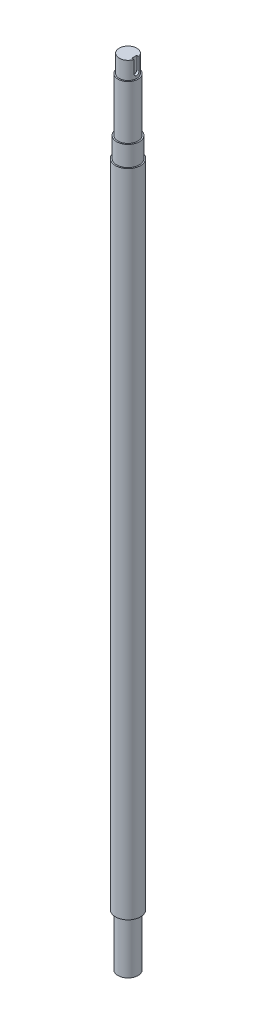
ISO-10303-21;
HEADER;
FILE_DESCRIPTION(('STEP AP214'),'2;1');
FILE_NAME('part.step','',(''),(''),'','','');
FILE_SCHEMA(('AUTOMOTIVE_DESIGN { 1 0 10303 214 1 1 1 1 }'));
ENDSEC;
DATA;
#1=APPLICATION_CONTEXT('core data for automotive mechanical design processes');
#2=APPLICATION_PROTOCOL_DEFINITION('international standard','automotive_design',2000,#1);
#3=PRODUCT_CONTEXT('',#1,'mechanical');
#4=PRODUCT('Part','Part','',(#3));
#5=PRODUCT_RELATED_PRODUCT_CATEGORY('part','',(#4));
#6=PRODUCT_DEFINITION_FORMATION('','',#4);
#7=PRODUCT_DEFINITION_CONTEXT('part definition',#1,'design');
#8=PRODUCT_DEFINITION('design','',#6,#7);
#9=PRODUCT_DEFINITION_SHAPE('','',#8);
#10=(LENGTH_UNIT() NAMED_UNIT(*) SI_UNIT(.MILLI.,.METRE.));
#11=(NAMED_UNIT(*) PLANE_ANGLE_UNIT() SI_UNIT($,.RADIAN.));
#12=(NAMED_UNIT(*) SI_UNIT($,.STERADIAN.) SOLID_ANGLE_UNIT());
#13=UNCERTAINTY_MEASURE_WITH_UNIT(LENGTH_MEASURE(1.E-05),#10,'distance_accuracy_value','');
#14=(GEOMETRIC_REPRESENTATION_CONTEXT(3) GLOBAL_UNCERTAINTY_ASSIGNED_CONTEXT((#13)) GLOBAL_UNIT_ASSIGNED_CONTEXT((#10,
#11,#12)) REPRESENTATION_CONTEXT('',''));
#15=CARTESIAN_POINT('',(0.,0.,0.));
#16=DIRECTION('',(0.,0.,1.));
#17=DIRECTION('',(1.,0.,0.));
#18=AXIS2_PLACEMENT_3D('',#15,#16,#17);
#19=CARTESIAN_POINT('',(12.5,1585.,0.));
#20=DIRECTION('',(-1.,0.,0.));
#21=DIRECTION('',(0.,0.,1.));
#22=AXIS2_PLACEMENT_3D('',#19,#20,#21);
#23=PLANE('',#22);
#24=DIRECTION('',(0.,-1.,0.));
#25=VECTOR('',#24,1.);
#26=CARTESIAN_POINT('',(12.5,1585.,5.));
#27=LINE('',#26,#25);
#28=CARTESIAN_POINT('',(12.5,1585.,5.));
#29=VERTEX_POINT('',#28);
#30=CARTESIAN_POINT('',(12.5,1560.,5.));
#31=VERTEX_POINT('',#30);
#32=EDGE_CURVE('E54',#29,#31,#27,.T.);
#33=ORIENTED_EDGE('',*,*,#32,.T.);
#34=CARTESIAN_POINT('',(12.5,1560.,0.));
#35=DIRECTION('',(1.,0.,0.));
#36=DIRECTION('',(0.,0.,-1.));
#37=AXIS2_PLACEMENT_3D('',#34,#35,#36);
#38=CIRCLE('',#37,5.);
#39=CARTESIAN_POINT('',(12.5,1560.,-5.));
#40=VERTEX_POINT('',#39);
#41=EDGE_CURVE('E20',#31,#40,#38,.T.);
#42=ORIENTED_EDGE('',*,*,#41,.T.);
#43=DIRECTION('',(0.,1.,0.));
#44=VECTOR('',#43,1.);
#45=CARTESIAN_POINT('',(12.5,1585.,-5.));
#46=LINE('',#45,#44);
#47=CARTESIAN_POINT('',(12.5,1585.,-5.));
#48=VERTEX_POINT('',#47);
#49=EDGE_CURVE('E58',#40,#48,#46,.T.);
#50=ORIENTED_EDGE('',*,*,#49,.T.);
#51=DIRECTION('',(0.,0.,1.));
#52=VECTOR('',#51,1.);
#53=CARTESIAN_POINT('',(12.5,1585.,0.));
#54=LINE('',#53,#52);
#55=EDGE_CURVE('E83',#29,#48,#54,.F.);
#56=ORIENTED_EDGE('',*,*,#55,.F.);
#57=EDGE_LOOP('',(#33,#42,#50,#56));
#58=FACE_BOUND('',#57,.T.);
#59=ADVANCED_FACE('F17',(#58),#23,.F.);
#60=CARTESIAN_POINT('',(12.5,1585.,-5.));
#61=DIRECTION('',(0.,0.,-1.));
#62=DIRECTION('',(0.,1.,0.));
#63=AXIS2_PLACEMENT_3D('',#60,#61,#62);
#64=PLANE('',#63);
#65=DIRECTION('',(1.,0.,0.));
#66=VECTOR('',#65,1.);
#67=CARTESIAN_POINT('',(0.,1585.,-5.));
#68=LINE('',#67,#66);
#69=CARTESIAN_POINT('',(16.7705098312484,1585.,-5.));
#70=VERTEX_POINT('',#69);
#71=EDGE_CURVE('E68',#48,#70,#68,.T.);
#72=ORIENTED_EDGE('',*,*,#71,.F.);
#73=ORIENTED_EDGE('',*,*,#49,.F.);
#74=DIRECTION('',(1.,0.,0.));
#75=VECTOR('',#74,1.);
#76=CARTESIAN_POINT('',(12.5,1560.,-5.));
#77=LINE('',#76,#75);
#78=CARTESIAN_POINT('',(16.7705098312484,1560.,-5.));
#79=VERTEX_POINT('',#78);
#80=EDGE_CURVE('E63',#40,#79,#77,.T.);
#81=ORIENTED_EDGE('',*,*,#80,.T.);
#82=DIRECTION('',(0.,1.,0.));
#83=VECTOR('',#82,1.);
#84=CARTESIAN_POINT('',(16.7705098312484,1550.,-5.));
#85=LINE('',#84,#83);
#86=EDGE_CURVE('E85',#70,#79,#85,.F.);
#87=ORIENTED_EDGE('',*,*,#86,.F.);
#88=EDGE_LOOP('',(#72,#73,#81,#87));
#89=FACE_BOUND('',#88,.T.);
#90=ADVANCED_FACE('F65',(#89),#64,.F.);
#91=CARTESIAN_POINT('',(12.5,1560.,0.));
#92=DIRECTION('',(1.,0.,0.));
#93=DIRECTION('',(0.,0.,-1.));
#94=AXIS2_PLACEMENT_3D('',#91,#92,#93);
#95=CYLINDRICAL_SURFACE('',#94,5.);
#96=CARTESIAN_POINT('',(16.7705098312484,1560.,-5.));
#97=CARTESIAN_POINT('',(16.7704912725158,1559.86245623305,-5.00001814544051));
#98=CARTESIAN_POINT('',(16.7722013219269,1559.72491937798,-4.99432529208163));
#99=CARTESIAN_POINT('',(16.7789431019967,1559.45088881072,-4.97165222541631));
#100=CARTESIAN_POINT('',(16.7839741438635,1559.31439488816,-4.9546743526792));
#101=CARTESIAN_POINT('',(16.7972068372472,1559.04374154598,-4.90961903685596));
#102=CARTESIAN_POINT('',(16.8054009743523,1558.90957737517,-4.88156789644714));
#103=CARTESIAN_POINT('',(16.8247046364187,1558.64420035801,-4.81461674604708));
#104=CARTESIAN_POINT('',(16.8358142264156,1558.51298757758,-4.77571649404061));
#105=CARTESIAN_POINT('',(16.8606149796878,1558.25446833938,-4.68740449021952));
#106=CARTESIAN_POINT('',(16.874304837985,1558.12715994464,-4.63799805032646));
#107=CARTESIAN_POINT('',(16.9038705765849,1557.87720063727,-4.52905522001684));
#108=CARTESIAN_POINT('',(16.9197472690052,1557.75455147663,-4.4695150643294));
#109=CARTESIAN_POINT('',(16.9699997678901,1557.39479163969,-4.27631278448763));
#110=CARTESIAN_POINT('',(17.0070149050761,1557.16570163811,-4.12801150136238));
#111=CARTESIAN_POINT('',(17.0850471293107,1556.72948603513,-3.79229915782706));
#112=CARTESIAN_POINT('',(17.1261428352531,1556.52307972534,-3.6039776700022));
#113=CARTESIAN_POINT('',(17.2070462516997,1556.14426230693,-3.19544341696445));
#114=CARTESIAN_POINT('',(17.2468537476932,1555.97185683596,-2.97522537348181));
#115=CARTESIAN_POINT('',(17.3215844019063,1555.66292190803,-2.50410851659348));
#116=CARTESIAN_POINT('',(17.3564029869975,1555.5271190757,-2.25271539483192));
#117=CARTESIAN_POINT('',(17.4163145657262,1555.29999228761,-1.7295093706008));
#118=CARTESIAN_POINT('',(17.4414098849257,1555.20865769481,-1.45770136944979));
#119=CARTESIAN_POINT('',(17.4784878135792,1555.07541429915,-0.908899275051271));
#120=CARTESIAN_POINT('',(17.4907954521753,1555.03227814541,-0.632225504452072));
#121=CARTESIAN_POINT('',(17.5020523750682,1554.99278330585,-0.0753060921049024));
#122=CARTESIAN_POINT('',(17.5010039299559,1554.99641666901,0.204938934421878));
#123=CARTESIAN_POINT('',(17.485900246778,1555.0495154802,0.752451373530494));
#124=CARTESIAN_POINT('',(17.4722220494946,1555.09765239927,1.01985970934217));
#125=CARTESIAN_POINT('',(17.433846479088,1555.23624082955,1.54263514692873));
#126=CARTESIAN_POINT('',(17.4091485496607,1555.32669447701,1.79800164008104));
#127=CARTESIAN_POINT('',(17.3509771517082,1555.54826637127,2.29267928834747));
#128=CARTESIAN_POINT('',(17.3174105731755,1555.67981895208,2.53178407311284));
#129=CARTESIAN_POINT('',(17.245062612945,1555.97964433358,2.98504901208604));
#130=CARTESIAN_POINT('',(17.2062801734237,1556.14792458728,3.19920408978388));
#131=CARTESIAN_POINT('',(17.1465202223136,1556.42762735883,3.50113424709602));
#132=CARTESIAN_POINT('',(17.1259700648702,1556.52736386435,3.60007423743557));
#133=CARTESIAN_POINT('',(17.0851123940087,1556.73482024234,3.78923134613097));
#134=CARTESIAN_POINT('',(17.0648047990745,1556.84253733987,3.87945147156869));
#135=CARTESIAN_POINT('',(17.0249868857384,1557.06534504099,4.05062437518872));
#136=CARTESIAN_POINT('',(17.0054771098742,1557.18044052987,4.13157091233093));
#137=CARTESIAN_POINT('',(16.967834642965,1557.4171607937,4.28353981460202));
#138=CARTESIAN_POINT('',(16.9497014175386,1557.53878300333,4.35456603991607));
#139=CARTESIAN_POINT('',(16.9151829895461,1557.78891595132,4.48679157824979));
#140=CARTESIAN_POINT('',(16.8988148966381,1557.9174786278,4.5478971849672));
#141=CARTESIAN_POINT('',(16.8685251216223,1558.17954149636,4.65898872141473));
#142=CARTESIAN_POINT('',(16.8546024466246,1558.31303965776,4.70897916633107));
#143=CARTESIAN_POINT('',(16.8296498541271,1558.58392101135,4.79739484975329));
#144=CARTESIAN_POINT('',(16.8186169160757,1558.72129997926,4.83583217063251));
#145=CARTESIAN_POINT('',(16.799786563193,1558.99899554565,4.90084834749699));
#146=CARTESIAN_POINT('',(16.7919876494693,1559.13931075152,4.92743269748));
#147=CARTESIAN_POINT('',(16.7808301521248,1559.39966511421,4.96528740578596));
#148=CARTESIAN_POINT('',(16.776966894118,1559.51943162973,4.97830600651658));
#149=CARTESIAN_POINT('',(16.7718034889731,1559.75946229482,4.99566040544715));
#150=CARTESIAN_POINT('',(16.77049943266,1559.87972540378,5.00000944654144));
#151=CARTESIAN_POINT('',(16.7705098312484,1560.,5.));
#152=B_SPLINE_CURVE_WITH_KNOTS('',3,(#96,#97,#98,#99,#100,#101,#102,#103,#104,#105,#106,#107,
#108,#109,#110,#111,#112,#113,#114,#115,#116,#117,#118,#119,#120,#121,#122,#123,#124,#125,#126,
#127,#128,#129,#130,#131,#132,#133,#134,#135,#136,#137,#138,#139,#140,#141,#142,#143,#144,#145,
#146,#147,#148,#149,#150,#151),.UNSPECIFIED.,.F.,.F.,(4,2,2,2,2,2,2,2,2,2,2,2,2,2,2,2,2,2,2,2,2,
2,2,2,2,2,2,4),(0.,0.412492178804846,0.824898831358243,1.23633171981302,1.64777378699104,
2.05900832185093,2.47039598941301,3.29264569343936,4.13611232627089,4.97971869650062,
5.83900986868887,6.69809539287298,7.53476732988492,8.3712970310191,9.1836338165559,
9.99601161556296,10.8172828992966,11.6387209961022,12.0642579015964,12.4896475313527,
12.9153217832827,13.3408299328954,13.7701489130532,14.1992931759086,14.6279870611773,
15.0564820344613,15.4177510461248,15.7784677892944),.UNSPECIFIED.);
#153=CARTESIAN_POINT('',(16.7705098312484,1560.,5.));
#154=VERTEX_POINT('',#153);
#155=EDGE_CURVE('E73',#79,#154,#152,.T.);
#156=ORIENTED_EDGE('',*,*,#155,.F.);
#157=ORIENTED_EDGE('',*,*,#80,.F.);
#158=ORIENTED_EDGE('',*,*,#41,.F.);
#159=DIRECTION('',(1.,0.,0.));
#160=VECTOR('',#159,1.);
#161=CARTESIAN_POINT('',(12.5,1560.,5.));
#162=LINE('',#161,#160);
#163=EDGE_CURVE('E76',#31,#154,#162,.T.);
#164=ORIENTED_EDGE('',*,*,#163,.T.);
#165=EDGE_LOOP('',(#156,#157,#158,#164));
#166=FACE_BOUND('',#165,.T.);
#167=ADVANCED_FACE('F71',(#166),#95,.F.);
#168=CARTESIAN_POINT('',(12.5,1585.,5.));
#169=DIRECTION('',(0.,0.,1.));
#170=DIRECTION('',(0.,-1.,0.));
#171=AXIS2_PLACEMENT_3D('',#168,#169,#170);
#172=PLANE('',#171);
#173=ORIENTED_EDGE('',*,*,#163,.F.);
#174=ORIENTED_EDGE('',*,*,#32,.F.);
#175=DIRECTION('',(1.,0.,0.));
#176=VECTOR('',#175,1.);
#177=CARTESIAN_POINT('',(0.,1585.,5.));
#178=LINE('',#177,#176);
#179=CARTESIAN_POINT('',(16.7705098312484,1585.,5.));
#180=VERTEX_POINT('',#179);
#181=EDGE_CURVE('E86',#180,#29,#178,.F.);
#182=ORIENTED_EDGE('',*,*,#181,.F.);
#183=DIRECTION('',(0.,1.,0.));
#184=VECTOR('',#183,1.);
#185=CARTESIAN_POINT('',(16.7705098312484,1550.,5.));
#186=LINE('',#185,#184);
#187=EDGE_CURVE('E114',#154,#180,#186,.T.);
#188=ORIENTED_EDGE('',*,*,#187,.F.);
#189=EDGE_LOOP('',(#173,#174,#182,#188));
#190=FACE_BOUND('',#189,.T.);
#191=ADVANCED_FACE('F132',(#190),#172,.F.);
#192=CARTESIAN_POINT('',(0.,1585.,0.));
#193=DIRECTION('',(0.,1.,0.));
#194=DIRECTION('',(0.,0.,1.));
#195=AXIS2_PLACEMENT_3D('',#192,#193,#194);
#196=PLANE('',#195);
#197=ORIENTED_EDGE('',*,*,#181,.T.);
#198=ORIENTED_EDGE('',*,*,#55,.T.);
#199=ORIENTED_EDGE('',*,*,#71,.T.);
#200=CARTESIAN_POINT('',(0.,1585.,0.));
#201=DIRECTION('',(0.,1.,0.));
#202=DIRECTION('',(0.,0.,1.));
#203=AXIS2_PLACEMENT_3D('',#200,#201,#202);
#204=CIRCLE('',#203,17.5);
#205=EDGE_CURVE('E35',#180,#70,#204,.F.);
#206=ORIENTED_EDGE('',*,*,#205,.F.);
#207=EDGE_LOOP('',(#197,#198,#199,#206));
#208=FACE_BOUND('',#207,.T.);
#209=ADVANCED_FACE('F128',(#208),#196,.T.);
#210=CARTESIAN_POINT('',(0.,1550.,0.));
#211=DIRECTION('',(0.,1.,0.));
#212=DIRECTION('',(0.,0.,1.));
#213=AXIS2_PLACEMENT_3D('',#210,#211,#212);
#214=CYLINDRICAL_SURFACE('',#213,17.5);
#215=CARTESIAN_POINT('',(0.,1550.,0.));
#216=DIRECTION('',(0.,1.,0.));
#217=DIRECTION('',(0.,0.,1.));
#218=AXIS2_PLACEMENT_3D('',#215,#216,#217);
#219=CIRCLE('',#218,17.5);
#220=CARTESIAN_POINT('',(0.,1550.,17.5));
#221=VERTEX_POINT('',#220);
#222=EDGE_CURVE('E111',#221,#221,#219,.F.);
#223=ORIENTED_EDGE('',*,*,#222,.F.);
#224=EDGE_LOOP('',(#223));
#225=FACE_BOUND('',#224,.T.);
#226=ORIENTED_EDGE('',*,*,#205,.T.);
#227=ORIENTED_EDGE('',*,*,#86,.T.);
#228=ORIENTED_EDGE('',*,*,#155,.T.);
#229=ORIENTED_EDGE('',*,*,#187,.T.);
#230=EDGE_LOOP('',(#226,#227,#228,#229));
#231=FACE_BOUND('',#230,.T.);
#232=ADVANCED_FACE('F122',(#225,#231),#214,.T.);
#233=CARTESIAN_POINT('',(0.,1550.,0.));
#234=DIRECTION('',(0.,1.,0.));
#235=DIRECTION('',(0.,0.,1.));
#236=AXIS2_PLACEMENT_3D('',#233,#234,#235);
#237=PLANE('',#236);
#238=CARTESIAN_POINT('',(0.,1550.,0.));
#239=DIRECTION('',(0.,1.,0.));
#240=DIRECTION('',(0.,0.,1.));
#241=AXIS2_PLACEMENT_3D('',#238,#239,#240);
#242=CIRCLE('',#241,20.);
#243=CARTESIAN_POINT('',(0.,1550.,20.));
#244=VERTEX_POINT('',#243);
#245=EDGE_CURVE('E108',#244,#244,#242,.F.);
#246=ORIENTED_EDGE('',*,*,#245,.F.);
#247=EDGE_LOOP('',(#246));
#248=FACE_BOUND('',#247,.T.);
#249=ORIENTED_EDGE('',*,*,#222,.T.);
#250=EDGE_LOOP('',(#249));
#251=FACE_BOUND('',#250,.T.);
#252=ADVANCED_FACE('F127',(#248,#251),#237,.T.);
#253=CARTESIAN_POINT('',(0.,1443.,0.));
#254=DIRECTION('',(0.,1.,0.));
#255=DIRECTION('',(0.,0.,1.));
#256=AXIS2_PLACEMENT_3D('',#253,#254,#255);
#257=CYLINDRICAL_SURFACE('',#256,20.);
#258=CARTESIAN_POINT('',(0.,1443.,0.));
#259=DIRECTION('',(0.,1.,0.));
#260=DIRECTION('',(0.,0.,1.));
#261=AXIS2_PLACEMENT_3D('',#258,#259,#260);
#262=CIRCLE('',#261,20.);
#263=CARTESIAN_POINT('',(0.,1443.,20.));
#264=VERTEX_POINT('',#263);
#265=EDGE_CURVE('E105',#264,#264,#262,.F.);
#266=ORIENTED_EDGE('',*,*,#265,.F.);
#267=EDGE_LOOP('',(#266));
#268=FACE_BOUND('',#267,.T.);
#269=ORIENTED_EDGE('',*,*,#245,.T.);
#270=EDGE_LOOP('',(#269));
#271=FACE_BOUND('',#270,.T.);
#272=ADVANCED_FACE('F171',(#268,#271),#257,.T.);
#273=CARTESIAN_POINT('',(0.,1443.,0.));
#274=DIRECTION('',(0.,1.,0.));
#275=DIRECTION('',(0.,0.,1.));
#276=AXIS2_PLACEMENT_3D('',#273,#274,#275);
#277=PLANE('',#276);
#278=CARTESIAN_POINT('',(0.,1443.,0.));
#279=DIRECTION('',(0.,1.,0.));
#280=DIRECTION('',(0.,0.,1.));
#281=AXIS2_PLACEMENT_3D('',#278,#279,#280);
#282=CIRCLE('',#281,22.5);
#283=CARTESIAN_POINT('',(0.,1443.,22.5));
#284=VERTEX_POINT('',#283);
#285=EDGE_CURVE('E102',#284,#284,#282,.F.);
#286=ORIENTED_EDGE('',*,*,#285,.F.);
#287=EDGE_LOOP('',(#286));
#288=FACE_BOUND('',#287,.T.);
#289=ORIENTED_EDGE('',*,*,#265,.T.);
#290=EDGE_LOOP('',(#289));
#291=FACE_BOUND('',#290,.T.);
#292=ADVANCED_FACE('F168',(#288,#291),#277,.T.);
#293=CARTESIAN_POINT('',(0.,0.,0.));
#294=DIRECTION('',(0.,1.,0.));
#295=DIRECTION('',(0.,0.,1.));
#296=AXIS2_PLACEMENT_3D('',#293,#294,#295);
#297=PLANE('',#296);
#298=CARTESIAN_POINT('',(0.,0.,0.));
#299=DIRECTION('',(0.,-1.,0.));
#300=DIRECTION('',(0.,0.,-1.));
#301=AXIS2_PLACEMENT_3D('',#298,#299,#300);
#302=CIRCLE('',#301,20.);
#303=CARTESIAN_POINT('',(0.,0.,-20.));
#304=VERTEX_POINT('',#303);
#305=EDGE_CURVE('E99',#304,#304,#302,.F.);
#306=ORIENTED_EDGE('',*,*,#305,.F.);
#307=EDGE_LOOP('',(#306));
#308=FACE_BOUND('',#307,.T.);
#309=ADVANCED_FACE('F164',(#308),#297,.F.);
#310=CARTESIAN_POINT('',(0.,1403.,0.));
#311=DIRECTION('',(0.,1.,0.));
#312=DIRECTION('',(0.,0.,1.));
#313=AXIS2_PLACEMENT_3D('',#310,#311,#312);
#314=CYLINDRICAL_SURFACE('',#313,22.5);
#315=CARTESIAN_POINT('',(0.,1403.,0.));
#316=DIRECTION('',(0.,1.,0.));
#317=DIRECTION('',(0.,0.,1.));
#318=AXIS2_PLACEMENT_3D('',#315,#316,#317);
#319=CIRCLE('',#318,22.5);
#320=CARTESIAN_POINT('',(0.,1403.,22.5));
#321=VERTEX_POINT('',#320);
#322=EDGE_CURVE('E96',#321,#321,#319,.F.);
#323=ORIENTED_EDGE('',*,*,#322,.F.);
#324=EDGE_LOOP('',(#323));
#325=FACE_BOUND('',#324,.T.);
#326=ORIENTED_EDGE('',*,*,#285,.T.);
#327=EDGE_LOOP('',(#326));
#328=FACE_BOUND('',#327,.T.);
#329=ADVANCED_FACE('F160',(#325,#328),#314,.T.);
#330=CARTESIAN_POINT('',(0.,104.,0.));
#331=DIRECTION('',(0.,-1.,0.));
#332=DIRECTION('',(0.,0.,-1.));
#333=AXIS2_PLACEMENT_3D('',#330,#331,#332);
#334=CYLINDRICAL_SURFACE('',#333,20.);
#335=CARTESIAN_POINT('',(0.,104.,0.));
#336=DIRECTION('',(0.,-1.,0.));
#337=DIRECTION('',(0.,0.,-1.));
#338=AXIS2_PLACEMENT_3D('',#335,#336,#337);
#339=CIRCLE('',#338,20.);
#340=CARTESIAN_POINT('',(0.,104.,-20.));
#341=VERTEX_POINT('',#340);
#342=EDGE_CURVE('E93',#341,#341,#339,.F.);
#343=ORIENTED_EDGE('',*,*,#342,.F.);
#344=EDGE_LOOP('',(#343));
#345=FACE_BOUND('',#344,.T.);
#346=ORIENTED_EDGE('',*,*,#305,.T.);
#347=EDGE_LOOP('',(#346));
#348=FACE_BOUND('',#347,.T.);
#349=ADVANCED_FACE('F156',(#345,#348),#334,.T.);
#350=CARTESIAN_POINT('',(0.,1403.,0.));
#351=DIRECTION('',(0.,1.,0.));
#352=DIRECTION('',(0.,0.,1.));
#353=AXIS2_PLACEMENT_3D('',#350,#351,#352);
#354=PLANE('',#353);
#355=CARTESIAN_POINT('',(0.,1403.,0.));
#356=DIRECTION('',(0.,-1.,0.));
#357=DIRECTION('',(0.,0.,-1.));
#358=AXIS2_PLACEMENT_3D('',#355,#356,#357);
#359=CIRCLE('',#358,25.);
#360=CARTESIAN_POINT('',(0.,1403.,-25.));
#361=VERTEX_POINT('',#360);
#362=EDGE_CURVE('E26',#361,#361,#359,.T.);
#363=ORIENTED_EDGE('',*,*,#362,.F.);
#364=EDGE_LOOP('',(#363));
#365=FACE_BOUND('',#364,.T.);
#366=ORIENTED_EDGE('',*,*,#322,.T.);
#367=EDGE_LOOP('',(#366));
#368=FACE_BOUND('',#367,.T.);
#369=ADVANCED_FACE('F149',(#365,#368),#354,.T.);
#370=CARTESIAN_POINT('',(0.,104.,0.));
#371=DIRECTION('',(0.,-1.,0.));
#372=DIRECTION('',(0.,0.,-1.));
#373=AXIS2_PLACEMENT_3D('',#370,#371,#372);
#374=PLANE('',#373);
#375=CARTESIAN_POINT('',(0.,104.,0.));
#376=DIRECTION('',(0.,-1.,0.));
#377=DIRECTION('',(0.,0.,-1.));
#378=AXIS2_PLACEMENT_3D('',#375,#376,#377);
#379=CIRCLE('',#378,25.);
#380=CARTESIAN_POINT('',(0.,104.,-25.));
#381=VERTEX_POINT('',#380);
#382=EDGE_CURVE('E11',#381,#381,#379,.F.);
#383=ORIENTED_EDGE('',*,*,#382,.F.);
#384=EDGE_LOOP('',(#383));
#385=FACE_BOUND('',#384,.T.);
#386=ORIENTED_EDGE('',*,*,#342,.T.);
#387=EDGE_LOOP('',(#386));
#388=FACE_BOUND('',#387,.T.);
#389=ADVANCED_FACE('F142',(#385,#388),#374,.T.);
#390=CARTESIAN_POINT('',(0.,1585.,0.));
#391=DIRECTION('',(0.,-1.,0.));
#392=DIRECTION('',(0.,0.,-1.));
#393=AXIS2_PLACEMENT_3D('',#390,#391,#392);
#394=CYLINDRICAL_SURFACE('',#393,25.);
#395=ORIENTED_EDGE('',*,*,#382,.T.);
#396=EDGE_LOOP('',(#395));
#397=FACE_BOUND('',#396,.T.);
#398=ORIENTED_EDGE('',*,*,#362,.T.);
#399=EDGE_LOOP('',(#398));
#400=FACE_BOUND('',#399,.T.);
#401=ADVANCED_FACE('F140',(#397,#400),#394,.T.);
#402=CLOSED_SHELL('',(#59,#90,#167,#191,#209,#232,#252,#272,#292,#309,#329,#349,#369,#389,#401));
#403=MANIFOLD_SOLID_BREP('B1',#402);
#404=ADVANCED_BREP_SHAPE_REPRESENTATION('',(#18,#403),#14);
#405=SHAPE_DEFINITION_REPRESENTATION(#9,#404);
ENDSEC;
END-ISO-10303-21;
